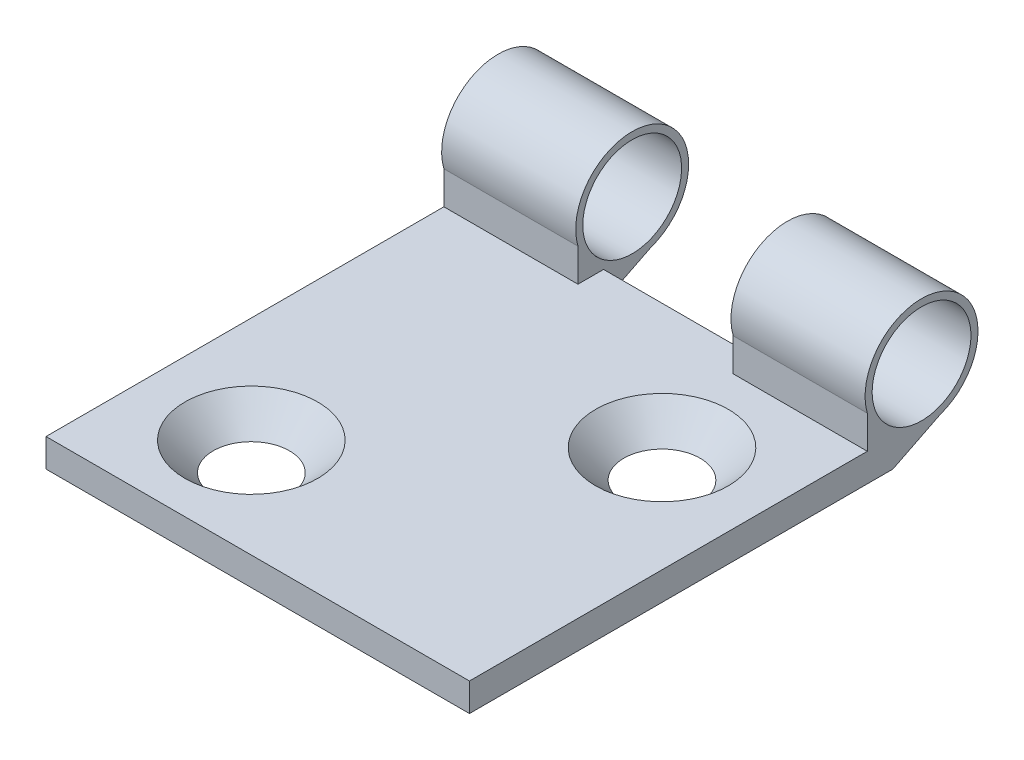
ISO-10303-21;
HEADER;
FILE_DESCRIPTION(('STEP AP214'),'2;1');
FILE_NAME('part.step','',(''),(''),'','','');
FILE_SCHEMA(('AUTOMOTIVE_DESIGN { 1 0 10303 214 1 1 1 1 }'));
ENDSEC;
DATA;
#1=APPLICATION_CONTEXT('core data for automotive mechanical design processes');
#2=APPLICATION_PROTOCOL_DEFINITION('international standard','automotive_design',2000,#1);
#3=PRODUCT_CONTEXT('',#1,'mechanical');
#4=PRODUCT('Part','Part','',(#3));
#5=PRODUCT_RELATED_PRODUCT_CATEGORY('part','',(#4));
#6=PRODUCT_DEFINITION_FORMATION('','',#4);
#7=PRODUCT_DEFINITION_CONTEXT('part definition',#1,'design');
#8=PRODUCT_DEFINITION('design','',#6,#7);
#9=PRODUCT_DEFINITION_SHAPE('','',#8);
#10=(LENGTH_UNIT() NAMED_UNIT(*) SI_UNIT(.MILLI.,.METRE.));
#11=(NAMED_UNIT(*) PLANE_ANGLE_UNIT() SI_UNIT($,.RADIAN.));
#12=(NAMED_UNIT(*) SI_UNIT($,.STERADIAN.) SOLID_ANGLE_UNIT());
#13=UNCERTAINTY_MEASURE_WITH_UNIT(LENGTH_MEASURE(1.E-05),#10,'distance_accuracy_value','');
#14=(GEOMETRIC_REPRESENTATION_CONTEXT(3) GLOBAL_UNCERTAINTY_ASSIGNED_CONTEXT((#13)) GLOBAL_UNIT_ASSIGNED_CONTEXT((#10,
#11,#12)) REPRESENTATION_CONTEXT('',''));
#15=CARTESIAN_POINT('',(0.,0.,0.));
#16=DIRECTION('',(0.,0.,1.));
#17=DIRECTION('',(1.,0.,0.));
#18=AXIS2_PLACEMENT_3D('',#15,#16,#17);
#19=CARTESIAN_POINT('',(-64.8325900662954,5.44729483614537,37.5772729853097));
#20=DIRECTION('',(-1.,0.,0.));
#21=DIRECTION('',(0.,0.,1.));
#22=AXIS2_PLACEMENT_3D('',#19,#20,#21);
#23=PLANE('',#22);
#24=CARTESIAN_POINT('',(-64.8325900662954,5.44729483614537,37.5772729853097));
#25=DIRECTION('',(-1.,0.,0.));
#26=DIRECTION('',(0.,0.,1.));
#27=AXIS2_PLACEMENT_3D('',#24,#25,#26);
#28=CIRCLE('',#27,3.5);
#29=CARTESIAN_POINT('',(-64.8325900662954,5.44729483614537,41.0772729853097));
#30=VERTEX_POINT('',#29);
#31=EDGE_CURVE('E192',#30,#30,#28,.T.);
#32=ORIENTED_EDGE('',*,*,#31,.F.);
#33=EDGE_LOOP('',(#32));
#34=FACE_BOUND('',#33,.T.);
#35=DIRECTION('',(0.,-0.446878954098618,0.894594433463413));
#36=VECTOR('',#35,1.);
#37=CARTESIAN_POINT('',(-64.8325900662954,1.66797014514625,36.2670421354193));
#38=LINE('',#37,#36);
#39=CARTESIAN_POINT('',(-64.8325900662954,1.66797014514625,36.2670421354193));
#40=VERTEX_POINT('',#39);
#41=CARTESIAN_POINT('',(-64.8325900662954,0.,39.6061047458767));
#42=VERTEX_POINT('',#41);
#43=EDGE_CURVE('E177',#40,#42,#38,.T.);
#44=ORIENTED_EDGE('',*,*,#43,.T.);
#45=DIRECTION('',(0.,1.,0.));
#46=VECTOR('',#45,1.);
#47=CARTESIAN_POINT('',(-64.8325900662954,5.44729483614537,39.6061047458767));
#48=LINE('',#47,#46);
#49=CARTESIAN_POINT('',(-64.8325900662954,2.,39.6061047458767));
#50=VERTEX_POINT('',#49);
#51=EDGE_CURVE('E52',#42,#50,#48,.T.);
#52=ORIENTED_EDGE('',*,*,#51,.T.);
#53=DIRECTION('',(0.,0.,-1.));
#54=VECTOR('',#53,1.);
#55=CARTESIAN_POINT('',(-64.8325900662954,2.,37.5772729853097));
#56=LINE('',#55,#54);
#57=CARTESIAN_POINT('',(-64.8325900662954,2.,41.4182043465664));
#58=VERTEX_POINT('',#57);
#59=EDGE_CURVE('E126',#58,#50,#56,.T.);
#60=ORIENTED_EDGE('',*,*,#59,.F.);
#61=DIRECTION('',(0.,1.,0.));
#62=VECTOR('',#61,1.);
#63=CARTESIAN_POINT('',(-64.8325900662954,2.,41.4182043465664));
#64=LINE('',#63,#62);
#65=CARTESIAN_POINT('',(-64.8325900662954,4.33049302825163,41.4182043465664));
#66=VERTEX_POINT('',#65);
#67=EDGE_CURVE('E58',#58,#66,#64,.T.);
#68=ORIENTED_EDGE('',*,*,#67,.T.);
#69=CARTESIAN_POINT('',(-64.8325900662954,5.44729483614537,37.5772729853097));
#70=DIRECTION('',(-1.,0.,0.));
#71=DIRECTION('',(0.,0.,1.));
#72=AXIS2_PLACEMENT_3D('',#69,#70,#71);
#73=CIRCLE('',#72,4.);
#74=EDGE_CURVE('E44',#66,#40,#73,.T.);
#75=ORIENTED_EDGE('',*,*,#74,.T.);
#76=EDGE_LOOP('',(#44,#52,#60,#68,#75));
#77=FACE_BOUND('',#76,.T.);
#78=ADVANCED_FACE('F35',(#34,#77),#23,.T.);
#79=CARTESIAN_POINT('',(-55.3325900662954,5.44729483614537,37.5772729853097));
#80=DIRECTION('',(-1.,0.,0.));
#81=DIRECTION('',(0.,0.,1.));
#82=AXIS2_PLACEMENT_3D('',#79,#80,#81);
#83=CYLINDRICAL_SURFACE('',#82,4.);
#84=DIRECTION('',(-1.,0.,0.));
#85=VECTOR('',#84,1.);
#86=CARTESIAN_POINT('',(-55.3325900662954,1.66797014514625,36.2670421354193));
#87=LINE('',#86,#85);
#88=CARTESIAN_POINT('',(-55.3325900662954,1.66797014514625,36.2670421354193));
#89=VERTEX_POINT('',#88);
#90=EDGE_CURVE('E185',#89,#40,#87,.T.);
#91=ORIENTED_EDGE('',*,*,#90,.T.);
#92=ORIENTED_EDGE('',*,*,#74,.F.);
#93=DIRECTION('',(-1.,0.,0.));
#94=VECTOR('',#93,1.);
#95=CARTESIAN_POINT('',(-55.3325900662954,4.33049302825164,41.4182043465664));
#96=LINE('',#95,#94);
#97=CARTESIAN_POINT('',(-55.3325900662954,4.33049302825164,41.4182043465664));
#98=VERTEX_POINT('',#97);
#99=EDGE_CURVE('E188',#98,#66,#96,.T.);
#100=ORIENTED_EDGE('',*,*,#99,.F.);
#101=CARTESIAN_POINT('',(-55.3325900662954,5.44729483614537,37.5772729853097));
#102=DIRECTION('',(-1.,0.,0.));
#103=DIRECTION('',(0.,0.,1.));
#104=AXIS2_PLACEMENT_3D('',#101,#102,#103);
#105=CIRCLE('',#104,4.);
#106=EDGE_CURVE('E11',#98,#89,#105,.T.);
#107=ORIENTED_EDGE('',*,*,#106,.T.);
#108=EDGE_LOOP('',(#91,#92,#100,#107));
#109=FACE_BOUND('',#108,.T.);
#110=ADVANCED_FACE('F37',(#109),#83,.T.);
#111=CARTESIAN_POINT('',(-55.3325900662954,5.44729483614537,37.5772729853097));
#112=DIRECTION('',(-1.,0.,0.));
#113=DIRECTION('',(0.,0.,1.));
#114=AXIS2_PLACEMENT_3D('',#111,#112,#113);
#115=PLANE('',#114);
#116=DIRECTION('',(0.,0.,-1.));
#117=VECTOR('',#116,1.);
#118=CARTESIAN_POINT('',(-55.3325900662954,0.,39.6061047458767));
#119=LINE('',#118,#117);
#120=CARTESIAN_POINT('',(-55.3325900662954,0.,69.6061047458767));
#121=VERTEX_POINT('',#120);
#122=CARTESIAN_POINT('',(-55.3325900662954,0.,39.6061047458767));
#123=VERTEX_POINT('',#122);
#124=EDGE_CURVE('E163',#121,#123,#119,.T.);
#125=ORIENTED_EDGE('',*,*,#124,.T.);
#126=DIRECTION('',(0.,-0.446878954098618,0.894594433463413));
#127=VECTOR('',#126,1.);
#128=CARTESIAN_POINT('',(-55.3325900662954,1.66797014514625,36.2670421354193));
#129=LINE('',#128,#127);
#130=EDGE_CURVE('E176',#89,#123,#129,.T.);
#131=ORIENTED_EDGE('',*,*,#130,.F.);
#132=ORIENTED_EDGE('',*,*,#106,.F.);
#133=DIRECTION('',(0.,1.,0.));
#134=VECTOR('',#133,1.);
#135=CARTESIAN_POINT('',(-55.3325900662954,2.,41.4182043465664));
#136=LINE('',#135,#134);
#137=CARTESIAN_POINT('',(-55.3325900662954,2.,41.4182043465664));
#138=VERTEX_POINT('',#137);
#139=EDGE_CURVE('E174',#138,#98,#136,.T.);
#140=ORIENTED_EDGE('',*,*,#139,.F.);
#141=DIRECTION('',(0.,0.,-1.));
#142=VECTOR('',#141,1.);
#143=CARTESIAN_POINT('',(-55.3325900662954,2.,39.6061047458767));
#144=LINE('',#143,#142);
#145=CARTESIAN_POINT('',(-55.3325900662954,2.,69.6061047458767));
#146=VERTEX_POINT('',#145);
#147=EDGE_CURVE('E130',#146,#138,#144,.T.);
#148=ORIENTED_EDGE('',*,*,#147,.F.);
#149=DIRECTION('',(0.,-1.,0.));
#150=VECTOR('',#149,1.);
#151=CARTESIAN_POINT('',(-55.3325900662954,2.,69.6061047458767));
#152=LINE('',#151,#150);
#153=EDGE_CURVE('E129',#146,#121,#152,.T.);
#154=ORIENTED_EDGE('',*,*,#153,.T.);
#155=EDGE_LOOP('',(#125,#131,#132,#140,#148,#154));
#156=FACE_BOUND('',#155,.T.);
#157=CARTESIAN_POINT('',(-55.3325900662954,5.44729483614537,37.5772729853097));
#158=DIRECTION('',(-1.,0.,0.));
#159=DIRECTION('',(0.,0.,1.));
#160=AXIS2_PLACEMENT_3D('',#157,#158,#159);
#161=CIRCLE('',#160,3.5);
#162=CARTESIAN_POINT('',(-55.3325900662954,5.44729483614537,41.0772729853097));
#163=VERTEX_POINT('',#162);
#164=EDGE_CURVE('E184',#163,#163,#161,.F.);
#165=ORIENTED_EDGE('',*,*,#164,.F.);
#166=EDGE_LOOP('',(#165));
#167=FACE_BOUND('',#166,.T.);
#168=ADVANCED_FACE('F306',(#156,#167),#115,.F.);
#169=CARTESIAN_POINT('',(-45.4330951296837,5.44729483614537,37.5772729853097));
#170=DIRECTION('',(-1.,0.,0.));
#171=DIRECTION('',(0.,0.,1.));
#172=AXIS2_PLACEMENT_3D('',#169,#170,#171);
#173=CYLINDRICAL_SURFACE('',#172,3.5);
#174=ORIENTED_EDGE('',*,*,#164,.T.);
#175=EDGE_LOOP('',(#174));
#176=FACE_BOUND('',#175,.T.);
#177=ORIENTED_EDGE('',*,*,#31,.T.);
#178=EDGE_LOOP('',(#177));
#179=FACE_BOUND('',#178,.T.);
#180=ADVANCED_FACE('F197',(#176,#179),#173,.F.);
#181=CARTESIAN_POINT('',(-55.3325900662954,1.66797014514625,36.2670421354193));
#182=DIRECTION('',(0.,-0.894594433463413,-0.446878954098618));
#183=DIRECTION('',(0.,0.446878954098618,-0.894594433463413));
#184=AXIS2_PLACEMENT_3D('',#181,#182,#183);
#185=PLANE('',#184);
#186=ORIENTED_EDGE('',*,*,#43,.F.);
#187=ORIENTED_EDGE('',*,*,#90,.F.);
#188=ORIENTED_EDGE('',*,*,#130,.T.);
#189=DIRECTION('',(-1.,0.,0.));
#190=VECTOR('',#189,1.);
#191=CARTESIAN_POINT('',(-55.3325900662954,0.,39.6061047458767));
#192=LINE('',#191,#190);
#193=EDGE_CURVE('E182',#123,#42,#192,.T.);
#194=ORIENTED_EDGE('',*,*,#193,.T.);
#195=EDGE_LOOP('',(#186,#187,#188,#194));
#196=FACE_BOUND('',#195,.T.);
#197=ADVANCED_FACE('F298',(#196),#185,.T.);
#198=CARTESIAN_POINT('',(-55.3325900662954,2.,41.4182043465664));
#199=DIRECTION('',(0.,0.,1.));
#200=DIRECTION('',(1.,0.,0.));
#201=AXIS2_PLACEMENT_3D('',#198,#199,#200);
#202=PLANE('',#201);
#203=ORIENTED_EDGE('',*,*,#67,.F.);
#204=DIRECTION('',(-1.,0.,0.));
#205=VECTOR('',#204,1.);
#206=CARTESIAN_POINT('',(-55.3325900662954,2.,41.4182043465664));
#207=LINE('',#206,#205);
#208=EDGE_CURVE('E179',#138,#58,#207,.T.);
#209=ORIENTED_EDGE('',*,*,#208,.F.);
#210=ORIENTED_EDGE('',*,*,#139,.T.);
#211=ORIENTED_EDGE('',*,*,#99,.T.);
#212=EDGE_LOOP('',(#203,#209,#210,#211));
#213=FACE_BOUND('',#212,.T.);
#214=ADVANCED_FACE('F292',(#213),#202,.T.);
#215=CARTESIAN_POINT('',(-85.3325900662954,2.,39.6061047458767));
#216=DIRECTION('',(0.,0.,1.));
#217=DIRECTION('',(1.,0.,0.));
#218=AXIS2_PLACEMENT_3D('',#215,#216,#217);
#219=PLANE('',#218);
#220=ORIENTED_EDGE('',*,*,#51,.F.);
#221=DIRECTION('',(-1.,0.,0.));
#222=VECTOR('',#221,1.);
#223=CARTESIAN_POINT('',(-85.3325900662954,0.,39.6061047458767));
#224=LINE('',#223,#222);
#225=CARTESIAN_POINT('',(-75.8325900662954,0.,39.6061047458767));
#226=VERTEX_POINT('',#225);
#227=EDGE_CURVE('E146',#42,#226,#224,.T.);
#228=ORIENTED_EDGE('',*,*,#227,.T.);
#229=DIRECTION('',(0.,-1.,0.));
#230=VECTOR('',#229,1.);
#231=CARTESIAN_POINT('',(-75.8325900662954,2.,39.6061047458767));
#232=LINE('',#231,#230);
#233=CARTESIAN_POINT('',(-75.8325900662954,2.,39.6061047458767));
#234=VERTEX_POINT('',#233);
#235=EDGE_CURVE('E138',#234,#226,#232,.T.);
#236=ORIENTED_EDGE('',*,*,#235,.F.);
#237=DIRECTION('',(-1.,0.,0.));
#238=VECTOR('',#237,1.);
#239=CARTESIAN_POINT('',(-85.3325900662954,2.,39.6061047458767));
#240=LINE('',#239,#238);
#241=EDGE_CURVE('E120',#50,#234,#240,.T.);
#242=ORIENTED_EDGE('',*,*,#241,.F.);
#243=EDGE_LOOP('',(#220,#228,#236,#242));
#244=FACE_BOUND('',#243,.T.);
#245=ADVANCED_FACE('F144',(#244),#219,.F.);
#246=CARTESIAN_POINT('',(-85.3325900662954,2.,39.6061047458767));
#247=DIRECTION('',(1.,0.,0.));
#248=DIRECTION('',(0.,0.,-1.));
#249=AXIS2_PLACEMENT_3D('',#246,#247,#248);
#250=PLANE('',#249);
#251=DIRECTION('',(0.,0.,1.));
#252=VECTOR('',#251,1.);
#253=CARTESIAN_POINT('',(-85.3325900662954,2.,39.6061047458767));
#254=LINE('',#253,#252);
#255=CARTESIAN_POINT('',(-85.3325900662954,2.,41.4182043465664));
#256=VERTEX_POINT('',#255);
#257=CARTESIAN_POINT('',(-85.3325900662954,2.,69.6061047458767));
#258=VERTEX_POINT('',#257);
#259=EDGE_CURVE('E154',#256,#258,#254,.T.);
#260=ORIENTED_EDGE('',*,*,#259,.F.);
#261=DIRECTION('',(0.,1.,0.));
#262=VECTOR('',#261,1.);
#263=CARTESIAN_POINT('',(-85.3325900662954,0.,41.4182043465664));
#264=LINE('',#263,#262);
#265=CARTESIAN_POINT('',(-85.3325900662954,4.33049302825164,41.4182043465664));
#266=VERTEX_POINT('',#265);
#267=EDGE_CURVE('E227',#256,#266,#264,.T.);
#268=ORIENTED_EDGE('',*,*,#267,.T.);
#269=CARTESIAN_POINT('',(-85.3325900662954,5.44729483614537,37.5772729853097));
#270=DIRECTION('',(-1.,0.,0.));
#271=DIRECTION('',(0.,0.,1.));
#272=AXIS2_PLACEMENT_3D('',#269,#270,#271);
#273=CIRCLE('',#272,4.);
#274=CARTESIAN_POINT('',(-85.3325900662954,1.66797014514625,36.2670421354193));
#275=VERTEX_POINT('',#274);
#276=EDGE_CURVE('E233',#266,#275,#273,.T.);
#277=ORIENTED_EDGE('',*,*,#276,.T.);
#278=DIRECTION('',(0.,-0.446878954098618,0.894594433463413));
#279=VECTOR('',#278,1.);
#280=CARTESIAN_POINT('',(-85.3325900662954,0.,39.6061047458767));
#281=LINE('',#280,#279);
#282=CARTESIAN_POINT('',(-85.3325900662954,0.,39.6061047458767));
#283=VERTEX_POINT('',#282);
#284=EDGE_CURVE('E216',#275,#283,#281,.T.);
#285=ORIENTED_EDGE('',*,*,#284,.T.);
#286=DIRECTION('',(0.,0.,1.));
#287=VECTOR('',#286,1.);
#288=CARTESIAN_POINT('',(-85.3325900662954,0.,39.6061047458767));
#289=LINE('',#288,#287);
#290=CARTESIAN_POINT('',(-85.3325900662954,0.,69.6061047458767));
#291=VERTEX_POINT('',#290);
#292=EDGE_CURVE('E150',#283,#291,#289,.T.);
#293=ORIENTED_EDGE('',*,*,#292,.T.);
#294=DIRECTION('',(0.,-1.,0.));
#295=VECTOR('',#294,1.);
#296=CARTESIAN_POINT('',(-85.3325900662954,2.,69.6061047458767));
#297=LINE('',#296,#295);
#298=EDGE_CURVE('E169',#258,#291,#297,.T.);
#299=ORIENTED_EDGE('',*,*,#298,.F.);
#300=EDGE_LOOP('',(#260,#268,#277,#285,#293,#299));
#301=FACE_BOUND('',#300,.T.);
#302=CARTESIAN_POINT('',(-85.3325900662954,5.44729483614537,37.5772729853097));
#303=DIRECTION('',(-1.,0.,0.));
#304=DIRECTION('',(0.,0.,1.));
#305=AXIS2_PLACEMENT_3D('',#302,#303,#304);
#306=CIRCLE('',#305,3.5);
#307=CARTESIAN_POINT('',(-85.3325900662954,5.44729483614537,41.0772729853097));
#308=VERTEX_POINT('',#307);
#309=EDGE_CURVE('E240',#308,#308,#306,.T.);
#310=ORIENTED_EDGE('',*,*,#309,.F.);
#311=EDGE_LOOP('',(#310));
#312=FACE_BOUND('',#311,.T.);
#313=ADVANCED_FACE('F291',(#301,#312),#250,.F.);
#314=CARTESIAN_POINT('',(-85.3325900662954,2.,69.6061047458767));
#315=DIRECTION('',(0.,0.,-1.));
#316=DIRECTION('',(-1.,0.,0.));
#317=AXIS2_PLACEMENT_3D('',#314,#315,#316);
#318=PLANE('',#317);
#319=DIRECTION('',(1.,0.,0.));
#320=VECTOR('',#319,1.);
#321=CARTESIAN_POINT('',(-85.3325900662954,0.,69.6061047458767));
#322=LINE('',#321,#320);
#323=EDGE_CURVE('E161',#291,#121,#322,.T.);
#324=ORIENTED_EDGE('',*,*,#323,.T.);
#325=ORIENTED_EDGE('',*,*,#153,.F.);
#326=DIRECTION('',(1.,0.,0.));
#327=VECTOR('',#326,1.);
#328=CARTESIAN_POINT('',(-85.3325900662954,2.,69.6061047458767));
#329=LINE('',#328,#327);
#330=EDGE_CURVE('E156',#258,#146,#329,.T.);
#331=ORIENTED_EDGE('',*,*,#330,.F.);
#332=ORIENTED_EDGE('',*,*,#298,.T.);
#333=EDGE_LOOP('',(#324,#325,#331,#332));
#334=FACE_BOUND('',#333,.T.);
#335=ADVANCED_FACE('F285',(#334),#318,.F.);
#336=CARTESIAN_POINT('',(0.,2.,0.));
#337=DIRECTION('',(0.,1.,0.));
#338=DIRECTION('',(0.,0.,1.));
#339=AXIS2_PLACEMENT_3D('',#336,#337,#338);
#340=PLANE('',#339);
#341=CARTESIAN_POINT('',(-62.8325900662954,2.,48.465179446394));
#342=DIRECTION('',(0.,1.,0.));
#343=DIRECTION('',(0.,0.,1.));
#344=AXIS2_PLACEMENT_3D('',#341,#342,#343);
#345=CIRCLE('',#344,4.7);
#346=CARTESIAN_POINT('',(-62.8325900662954,2.,53.165179446394));
#347=VERTEX_POINT('',#346);
#348=EDGE_CURVE('E249',#347,#347,#345,.T.);
#349=ORIENTED_EDGE('',*,*,#348,.F.);
#350=EDGE_LOOP('',(#349));
#351=FACE_BOUND('',#350,.T.);
#352=CARTESIAN_POINT('',(-77.8325900662954,2.,62.5591296460491));
#353=DIRECTION('',(0.,1.,0.));
#354=DIRECTION('',(0.,0.,1.));
#355=AXIS2_PLACEMENT_3D('',#352,#353,#354);
#356=CIRCLE('',#355,4.7);
#357=CARTESIAN_POINT('',(-77.8325900662954,2.,67.2591296460491));
#358=VERTEX_POINT('',#357);
#359=EDGE_CURVE('E246',#358,#358,#356,.T.);
#360=ORIENTED_EDGE('',*,*,#359,.F.);
#361=EDGE_LOOP('',(#360));
#362=FACE_BOUND('',#361,.T.);
#363=ORIENTED_EDGE('',*,*,#208,.T.);
#364=ORIENTED_EDGE('',*,*,#59,.T.);
#365=ORIENTED_EDGE('',*,*,#241,.T.);
#366=DIRECTION('',(0.,0.,1.));
#367=VECTOR('',#366,1.);
#368=CARTESIAN_POINT('',(-75.8325900662954,2.,0.));
#369=LINE('',#368,#367);
#370=CARTESIAN_POINT('',(-75.8325900662954,2.,41.4182043465664));
#371=VERTEX_POINT('',#370);
#372=EDGE_CURVE('E124',#234,#371,#369,.T.);
#373=ORIENTED_EDGE('',*,*,#372,.T.);
#374=DIRECTION('',(1.,0.,0.));
#375=VECTOR('',#374,1.);
#376=CARTESIAN_POINT('',(0.,2.,41.4182043465664));
#377=LINE('',#376,#375);
#378=EDGE_CURVE('E148',#256,#371,#377,.T.);
#379=ORIENTED_EDGE('',*,*,#378,.F.);
#380=ORIENTED_EDGE('',*,*,#259,.T.);
#381=ORIENTED_EDGE('',*,*,#330,.T.);
#382=ORIENTED_EDGE('',*,*,#147,.T.);
#383=EDGE_LOOP('',(#363,#364,#365,#373,#379,#380,#381,#382));
#384=FACE_BOUND('',#383,.T.);
#385=ADVANCED_FACE('F123',(#351,#362,#384),#340,.T.);
#386=CARTESIAN_POINT('',(0.,0.,0.));
#387=DIRECTION('',(0.,1.,0.));
#388=DIRECTION('',(0.,0.,1.));
#389=AXIS2_PLACEMENT_3D('',#386,#387,#388);
#390=PLANE('',#389);
#391=CARTESIAN_POINT('',(-62.8325900662954,0.,48.465179446394));
#392=DIRECTION('',(0.,1.,0.));
#393=DIRECTION('',(0.,0.,1.));
#394=AXIS2_PLACEMENT_3D('',#391,#392,#393);
#395=CIRCLE('',#394,2.7);
#396=CARTESIAN_POINT('',(-62.8325900662954,0.,51.165179446394));
#397=VERTEX_POINT('',#396);
#398=EDGE_CURVE('E39',#397,#397,#395,.T.);
#399=ORIENTED_EDGE('',*,*,#398,.T.);
#400=EDGE_LOOP('',(#399));
#401=FACE_BOUND('',#400,.T.);
#402=CARTESIAN_POINT('',(-77.8325900662954,0.,62.5591296460491));
#403=DIRECTION('',(0.,1.,0.));
#404=DIRECTION('',(0.,0.,1.));
#405=AXIS2_PLACEMENT_3D('',#402,#403,#404);
#406=CIRCLE('',#405,2.7);
#407=CARTESIAN_POINT('',(-77.8325900662954,0.,65.2591296460491));
#408=VERTEX_POINT('',#407);
#409=EDGE_CURVE('E243',#408,#408,#406,.T.);
#410=ORIENTED_EDGE('',*,*,#409,.T.);
#411=EDGE_LOOP('',(#410));
#412=FACE_BOUND('',#411,.T.);
#413=ORIENTED_EDGE('',*,*,#323,.F.);
#414=ORIENTED_EDGE('',*,*,#292,.F.);
#415=DIRECTION('',(-1.,0.,0.));
#416=VECTOR('',#415,1.);
#417=CARTESIAN_POINT('',(-75.8325900662954,0.,39.6061047458767));
#418=LINE('',#417,#416);
#419=EDGE_CURVE('E142',#226,#283,#418,.T.);
#420=ORIENTED_EDGE('',*,*,#419,.F.);
#421=ORIENTED_EDGE('',*,*,#227,.F.);
#422=ORIENTED_EDGE('',*,*,#193,.F.);
#423=ORIENTED_EDGE('',*,*,#124,.F.);
#424=EDGE_LOOP('',(#413,#414,#420,#421,#422,#423));
#425=FACE_BOUND('',#424,.T.);
#426=ADVANCED_FACE('F205',(#401,#412,#425),#390,.F.);
#427=CARTESIAN_POINT('',(-75.8325900662954,5.44729483614537,37.5772729853097));
#428=DIRECTION('',(-1.,0.,0.));
#429=DIRECTION('',(0.,0.,1.));
#430=AXIS2_PLACEMENT_3D('',#427,#428,#429);
#431=PLANE('',#430);
#432=DIRECTION('',(0.,-0.446878954098618,0.894594433463413));
#433=VECTOR('',#432,1.);
#434=CARTESIAN_POINT('',(-75.8325900662954,0.,39.6061047458767));
#435=LINE('',#434,#433);
#436=CARTESIAN_POINT('',(-75.8325900662954,1.66797014514625,36.2670421354193));
#437=VERTEX_POINT('',#436);
#438=EDGE_CURVE('E219',#437,#226,#435,.T.);
#439=ORIENTED_EDGE('',*,*,#438,.F.);
#440=CARTESIAN_POINT('',(-75.8325900662954,5.44729483614537,37.5772729853097));
#441=DIRECTION('',(-1.,0.,0.));
#442=DIRECTION('',(0.,0.,1.));
#443=AXIS2_PLACEMENT_3D('',#440,#441,#442);
#444=CIRCLE('',#443,4.);
#445=CARTESIAN_POINT('',(-75.8325900662954,4.33049302825164,41.4182043465664));
#446=VERTEX_POINT('',#445);
#447=EDGE_CURVE('E228',#446,#437,#444,.T.);
#448=ORIENTED_EDGE('',*,*,#447,.F.);
#449=DIRECTION('',(0.,1.,0.));
#450=VECTOR('',#449,1.);
#451=CARTESIAN_POINT('',(-75.8325900662954,0.,41.4182043465664));
#452=LINE('',#451,#450);
#453=EDGE_CURVE('E141',#371,#446,#452,.T.);
#454=ORIENTED_EDGE('',*,*,#453,.F.);
#455=ORIENTED_EDGE('',*,*,#372,.F.);
#456=ORIENTED_EDGE('',*,*,#235,.T.);
#457=EDGE_LOOP('',(#439,#448,#454,#455,#456));
#458=FACE_BOUND('',#457,.T.);
#459=CARTESIAN_POINT('',(-75.8325900662954,5.44729483614537,37.5772729853097));
#460=DIRECTION('',(-1.,0.,0.));
#461=DIRECTION('',(0.,0.,1.));
#462=AXIS2_PLACEMENT_3D('',#459,#460,#461);
#463=CIRCLE('',#462,3.5);
#464=CARTESIAN_POINT('',(-75.8325900662954,5.44729483614537,41.0772729853097));
#465=VERTEX_POINT('',#464);
#466=EDGE_CURVE('E236',#465,#465,#463,.T.);
#467=ORIENTED_EDGE('',*,*,#466,.T.);
#468=EDGE_LOOP('',(#467));
#469=FACE_BOUND('',#468,.T.);
#470=ADVANCED_FACE('F136',(#458,#469),#431,.F.);
#471=CARTESIAN_POINT('',(-75.8325900662954,0.,39.6061047458767));
#472=DIRECTION('',(0.,-0.894594433463413,-0.446878954098618));
#473=DIRECTION('',(0.,0.446878954098618,-0.894594433463413));
#474=AXIS2_PLACEMENT_3D('',#471,#472,#473);
#475=PLANE('',#474);
#476=ORIENTED_EDGE('',*,*,#284,.F.);
#477=DIRECTION('',(-1.,0.,0.));
#478=VECTOR('',#477,1.);
#479=CARTESIAN_POINT('',(-75.8325900662954,1.66797014514625,36.2670421354193));
#480=LINE('',#479,#478);
#481=EDGE_CURVE('E210',#437,#275,#480,.T.);
#482=ORIENTED_EDGE('',*,*,#481,.F.);
#483=ORIENTED_EDGE('',*,*,#438,.T.);
#484=ORIENTED_EDGE('',*,*,#419,.T.);
#485=EDGE_LOOP('',(#476,#482,#483,#484));
#486=FACE_BOUND('',#485,.T.);
#487=ADVANCED_FACE('F278',(#486),#475,.T.);
#488=CARTESIAN_POINT('',(-75.8325900662954,0.,41.4182043465664));
#489=DIRECTION('',(0.,0.,1.));
#490=DIRECTION('',(1.,0.,0.));
#491=AXIS2_PLACEMENT_3D('',#488,#489,#490);
#492=PLANE('',#491);
#493=ORIENTED_EDGE('',*,*,#267,.F.);
#494=ORIENTED_EDGE('',*,*,#378,.T.);
#495=ORIENTED_EDGE('',*,*,#453,.T.);
#496=DIRECTION('',(-1.,0.,0.));
#497=VECTOR('',#496,1.);
#498=CARTESIAN_POINT('',(-75.8325900662954,4.33049302825164,41.4182043465664));
#499=LINE('',#498,#497);
#500=EDGE_CURVE('E213',#446,#266,#499,.T.);
#501=ORIENTED_EDGE('',*,*,#500,.T.);
#502=EDGE_LOOP('',(#493,#494,#495,#501));
#503=FACE_BOUND('',#502,.T.);
#504=ADVANCED_FACE('F275',(#503),#492,.T.);
#505=CARTESIAN_POINT('',(-75.8325900662954,5.44729483614537,37.5772729853097));
#506=DIRECTION('',(-1.,0.,0.));
#507=DIRECTION('',(0.,0.,1.));
#508=AXIS2_PLACEMENT_3D('',#505,#506,#507);
#509=CYLINDRICAL_SURFACE('',#508,4.);
#510=ORIENTED_EDGE('',*,*,#447,.T.);
#511=ORIENTED_EDGE('',*,*,#481,.T.);
#512=ORIENTED_EDGE('',*,*,#276,.F.);
#513=ORIENTED_EDGE('',*,*,#500,.F.);
#514=EDGE_LOOP('',(#510,#511,#512,#513));
#515=FACE_BOUND('',#514,.T.);
#516=ADVANCED_FACE('F271',(#515),#509,.T.);
#517=CARTESIAN_POINT('',(-45.4330951296837,5.44729483614537,37.5772729853097));
#518=DIRECTION('',(-1.,0.,0.));
#519=DIRECTION('',(0.,0.,1.));
#520=AXIS2_PLACEMENT_3D('',#517,#518,#519);
#521=CYLINDRICAL_SURFACE('',#520,3.5);
#522=ORIENTED_EDGE('',*,*,#309,.T.);
#523=EDGE_LOOP('',(#522));
#524=FACE_BOUND('',#523,.T.);
#525=ORIENTED_EDGE('',*,*,#466,.F.);
#526=EDGE_LOOP('',(#525));
#527=FACE_BOUND('',#526,.T.);
#528=ADVANCED_FACE('F265',(#524,#527),#521,.F.);
#529=CARTESIAN_POINT('',(-77.8325900662954,2.,62.5591296460491));
#530=DIRECTION('',(0.,1.,0.));
#531=DIRECTION('',(0.,0.,1.));
#532=AXIS2_PLACEMENT_3D('',#529,#530,#531);
#533=CONICAL_SURFACE('',#532,4.7,0.785398163397448);
#534=ORIENTED_EDGE('',*,*,#359,.T.);
#535=EDGE_LOOP('',(#534));
#536=FACE_BOUND('',#535,.T.);
#537=ORIENTED_EDGE('',*,*,#409,.F.);
#538=EDGE_LOOP('',(#537));
#539=FACE_BOUND('',#538,.T.);
#540=ADVANCED_FACE('F260',(#536,#539),#533,.F.);
#541=CARTESIAN_POINT('',(-62.8325900662954,2.,48.465179446394));
#542=DIRECTION('',(0.,1.,0.));
#543=DIRECTION('',(0.,0.,1.));
#544=AXIS2_PLACEMENT_3D('',#541,#542,#543);
#545=CONICAL_SURFACE('',#544,4.7,0.785398163397448);
#546=ORIENTED_EDGE('',*,*,#348,.T.);
#547=EDGE_LOOP('',(#546));
#548=FACE_BOUND('',#547,.T.);
#549=ORIENTED_EDGE('',*,*,#398,.F.);
#550=EDGE_LOOP('',(#549));
#551=FACE_BOUND('',#550,.T.);
#552=ADVANCED_FACE('F258',(#548,#551),#545,.F.);
#553=CLOSED_SHELL('',(#78,#110,#168,#180,#197,#214,#245,#313,#335,#385,#426,#470,#487,#504,#516,
#528,#540,#552));
#554=MANIFOLD_SOLID_BREP('B2',#553);
#555=ADVANCED_BREP_SHAPE_REPRESENTATION('',(#18,#554),#14);
#556=SHAPE_DEFINITION_REPRESENTATION(#9,#555);
ENDSEC;
END-ISO-10303-21;
